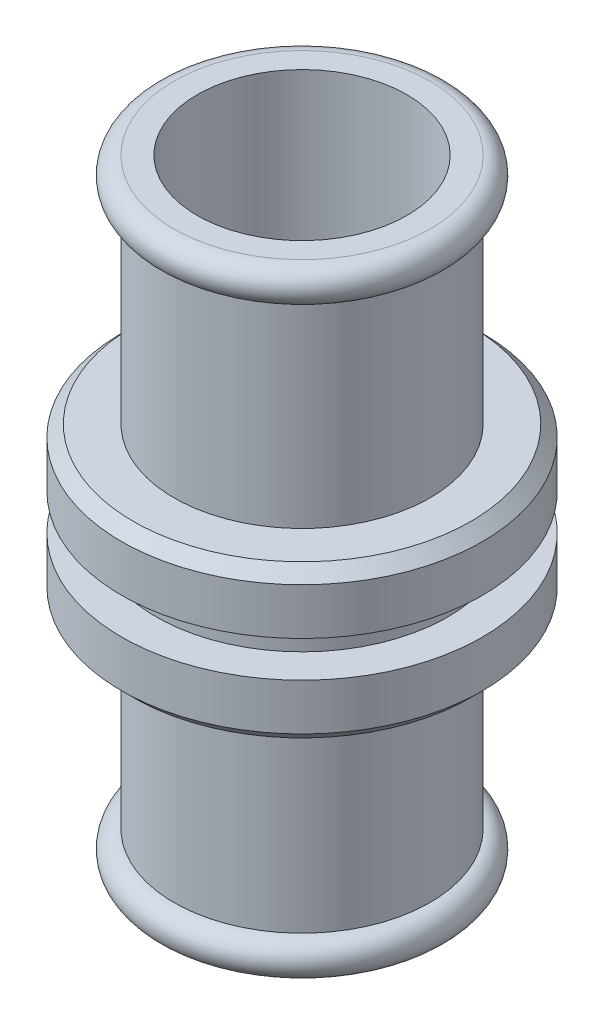
ISO-10303-21;
HEADER;
FILE_DESCRIPTION(('STEP AP214'),'2;1');
FILE_NAME('part.step','',(''),(''),'','','');
FILE_SCHEMA(('AUTOMOTIVE_DESIGN { 1 0 10303 214 1 1 1 1 }'));
ENDSEC;
DATA;
#1=APPLICATION_CONTEXT('core data for automotive mechanical design processes');
#2=APPLICATION_PROTOCOL_DEFINITION('international standard','automotive_design',2000,#1);
#3=PRODUCT_CONTEXT('',#1,'mechanical');
#4=PRODUCT('Part','Part','',(#3));
#5=PRODUCT_RELATED_PRODUCT_CATEGORY('part','',(#4));
#6=PRODUCT_DEFINITION_FORMATION('','',#4);
#7=PRODUCT_DEFINITION_CONTEXT('part definition',#1,'design');
#8=PRODUCT_DEFINITION('design','',#6,#7);
#9=PRODUCT_DEFINITION_SHAPE('','',#8);
#10=(LENGTH_UNIT() NAMED_UNIT(*) SI_UNIT(.MILLI.,.METRE.));
#11=(NAMED_UNIT(*) PLANE_ANGLE_UNIT() SI_UNIT($,.RADIAN.));
#12=(NAMED_UNIT(*) SI_UNIT($,.STERADIAN.) SOLID_ANGLE_UNIT());
#13=UNCERTAINTY_MEASURE_WITH_UNIT(LENGTH_MEASURE(1.E-05),#10,'distance_accuracy_value','');
#14=(GEOMETRIC_REPRESENTATION_CONTEXT(3) GLOBAL_UNCERTAINTY_ASSIGNED_CONTEXT((#13)) GLOBAL_UNIT_ASSIGNED_CONTEXT((#10,
#11,#12)) REPRESENTATION_CONTEXT('',''));
#15=CARTESIAN_POINT('',(0.,0.,0.));
#16=DIRECTION('',(0.,0.,1.));
#17=DIRECTION('',(1.,0.,0.));
#18=AXIS2_PLACEMENT_3D('',#15,#16,#17);
#19=CARTESIAN_POINT('',(-7.75000000000001,11.,0.));
#20=DIRECTION('',(0.,-1.,0.));
#21=DIRECTION('',(0.,0.,-1.));
#22=AXIS2_PLACEMENT_3D('',#19,#20,#21);
#23=TOROIDAL_SURFACE('',#22,11.,1.5);
#24=CARTESIAN_POINT('',(-7.75000000000001,9.49999999999995,0.));
#25=DIRECTION('',(0.,-1.,0.));
#26=DIRECTION('',(0.,0.,-1.));
#27=AXIS2_PLACEMENT_3D('',#24,#25,#26);
#28=CIRCLE('',#27,11.);
#29=CARTESIAN_POINT('',(-7.75000000000001,9.49999999999995,-11.));
#30=VERTEX_POINT('',#29);
#31=EDGE_CURVE('E94',#30,#30,#28,.T.);
#32=ORIENTED_EDGE('',*,*,#31,.F.);
#33=EDGE_LOOP('',(#32));
#34=FACE_BOUND('',#33,.T.);
#35=CARTESIAN_POINT('',(-7.75000000000001,12.5,0.));
#36=DIRECTION('',(0.,-1.,0.));
#37=DIRECTION('',(0.,0.,-1.));
#38=AXIS2_PLACEMENT_3D('',#35,#36,#37);
#39=CIRCLE('',#38,11.);
#40=CARTESIAN_POINT('',(-7.75000000000001,12.5,-11.));
#41=VERTEX_POINT('',#40);
#42=EDGE_CURVE('E12',#41,#41,#39,.T.);
#43=ORIENTED_EDGE('',*,*,#42,.T.);
#44=EDGE_LOOP('',(#43));
#45=FACE_BOUND('',#44,.T.);
#46=ADVANCED_FACE('F42',(#34,#45),#23,.T.);
#47=CARTESIAN_POINT('',(0.,12.5,0.));
#48=DIRECTION('',(0.,-1.,0.));
#49=DIRECTION('',(0.,0.,-1.));
#50=AXIS2_PLACEMENT_3D('',#47,#48,#49);
#51=PLANE('',#50);
#52=ORIENTED_EDGE('',*,*,#42,.F.);
#53=EDGE_LOOP('',(#52));
#54=FACE_BOUND('',#53,.T.);
#55=CARTESIAN_POINT('',(-7.75000000000001,12.5,0.));
#56=DIRECTION('',(0.,-1.,0.));
#57=DIRECTION('',(0.,0.,-1.));
#58=AXIS2_PLACEMENT_3D('',#55,#56,#57);
#59=CIRCLE('',#58,9.);
#60=CARTESIAN_POINT('',(-7.75000000000001,12.5,-9.));
#61=VERTEX_POINT('',#60);
#62=EDGE_CURVE('E48',#61,#61,#59,.T.);
#63=ORIENTED_EDGE('',*,*,#62,.T.);
#64=EDGE_LOOP('',(#63));
#65=FACE_BOUND('',#64,.T.);
#66=ADVANCED_FACE('F102',(#54,#65),#51,.F.);
#67=CARTESIAN_POINT('',(-7.75000000000001,-7.49999999999995,0.));
#68=DIRECTION('',(0.,-1.,0.));
#69=DIRECTION('',(0.,0.,-1.));
#70=AXIS2_PLACEMENT_3D('',#67,#68,#69);
#71=CYLINDRICAL_SURFACE('',#70,9.);
#72=CARTESIAN_POINT('',(-7.75000000000001,-40.6022761908766,0.));
#73=DIRECTION('',(0.,-1.,0.));
#74=DIRECTION('',(0.,0.,-1.));
#75=AXIS2_PLACEMENT_3D('',#72,#73,#74);
#76=CIRCLE('',#75,9.);
#77=CARTESIAN_POINT('',(-7.75000000000001,-40.6022761908766,-9.));
#78=VERTEX_POINT('',#77);
#79=EDGE_CURVE('E52',#78,#78,#76,.T.);
#80=ORIENTED_EDGE('',*,*,#79,.T.);
#81=EDGE_LOOP('',(#80));
#82=FACE_BOUND('',#81,.T.);
#83=ORIENTED_EDGE('',*,*,#62,.F.);
#84=EDGE_LOOP('',(#83));
#85=FACE_BOUND('',#84,.T.);
#86=ADVANCED_FACE('F106',(#82,#85),#71,.F.);
#87=CARTESIAN_POINT('',(-1.38777878078145E-13,-40.6022761908766,0.));
#88=DIRECTION('',(0.,-1.,0.));
#89=DIRECTION('',(0.,0.,-1.));
#90=AXIS2_PLACEMENT_3D('',#87,#88,#89);
#91=PLANE('',#90);
#92=CARTESIAN_POINT('',(-7.75000000000001,-40.6022761908766,0.));
#93=DIRECTION('',(0.,-1.,0.));
#94=DIRECTION('',(0.,0.,-1.));
#95=AXIS2_PLACEMENT_3D('',#92,#93,#94);
#96=CIRCLE('',#95,11.);
#97=CARTESIAN_POINT('',(-7.75000000000001,-40.6022761908766,-11.));
#98=VERTEX_POINT('',#97);
#99=EDGE_CURVE('E56',#98,#98,#96,.T.);
#100=ORIENTED_EDGE('',*,*,#99,.T.);
#101=EDGE_LOOP('',(#100));
#102=FACE_BOUND('',#101,.T.);
#103=ORIENTED_EDGE('',*,*,#79,.F.);
#104=EDGE_LOOP('',(#103));
#105=FACE_BOUND('',#104,.T.);
#106=ADVANCED_FACE('F111',(#102,#105),#91,.T.);
#107=CARTESIAN_POINT('',(-7.75000000000001,-39.1022761908767,0.));
#108=DIRECTION('',(0.,-1.,0.));
#109=DIRECTION('',(0.,0.,-1.));
#110=AXIS2_PLACEMENT_3D('',#107,#108,#109);
#111=TOROIDAL_SURFACE('',#110,11.,1.5);
#112=CARTESIAN_POINT('',(-7.75000000000001,-37.6022761908766,0.));
#113=DIRECTION('',(0.,-1.,0.));
#114=DIRECTION('',(0.,0.,-1.));
#115=AXIS2_PLACEMENT_3D('',#112,#113,#114);
#116=CIRCLE('',#115,11.);
#117=CARTESIAN_POINT('',(-7.75000000000001,-37.6022761908766,-11.));
#118=VERTEX_POINT('',#117);
#119=EDGE_CURVE('E61',#118,#118,#116,.T.);
#120=ORIENTED_EDGE('',*,*,#119,.T.);
#121=EDGE_LOOP('',(#120));
#122=FACE_BOUND('',#121,.T.);
#123=ORIENTED_EDGE('',*,*,#99,.F.);
#124=EDGE_LOOP('',(#123));
#125=FACE_BOUND('',#124,.T.);
#126=ADVANCED_FACE('F117',(#122,#125),#111,.T.);
#127=CARTESIAN_POINT('',(-7.75000000000001,-7.49999999999995,0.));
#128=DIRECTION('',(0.,-1.,0.));
#129=DIRECTION('',(0.,0.,-1.));
#130=AXIS2_PLACEMENT_3D('',#127,#128,#129);
#131=CYLINDRICAL_SURFACE('',#130,11.);
#132=ORIENTED_EDGE('',*,*,#119,.F.);
#133=EDGE_LOOP('',(#132));
#134=FACE_BOUND('',#133,.T.);
#135=CARTESIAN_POINT('',(-7.75000000000001,-20.6022761908766,0.));
#136=DIRECTION('',(0.,-1.,0.));
#137=DIRECTION('',(0.,0.,-1.));
#138=AXIS2_PLACEMENT_3D('',#135,#136,#137);
#139=CIRCLE('',#138,11.);
#140=CARTESIAN_POINT('',(-7.75000000000001,-20.6022761908766,-11.));
#141=VERTEX_POINT('',#140);
#142=EDGE_CURVE('E64',#141,#141,#139,.T.);
#143=ORIENTED_EDGE('',*,*,#142,.T.);
#144=EDGE_LOOP('',(#143));
#145=FACE_BOUND('',#144,.T.);
#146=ADVANCED_FACE('F121',(#134,#145),#131,.T.);
#147=CARTESIAN_POINT('',(0.,-20.6022761908766,0.));
#148=DIRECTION('',(0.,-1.,0.));
#149=DIRECTION('',(0.,0.,-1.));
#150=AXIS2_PLACEMENT_3D('',#147,#148,#149);
#151=PLANE('',#150);
#152=CARTESIAN_POINT('',(-7.75000000000001,-20.6022761908766,0.));
#153=DIRECTION('',(0.,-1.,0.));
#154=DIRECTION('',(0.,0.,-1.));
#155=AXIS2_PLACEMENT_3D('',#152,#153,#154);
#156=CIRCLE('',#155,14.5);
#157=CARTESIAN_POINT('',(-7.75000000000001,-20.6022761908766,-14.5));
#158=VERTEX_POINT('',#157);
#159=EDGE_CURVE('E67',#158,#158,#156,.T.);
#160=ORIENTED_EDGE('',*,*,#159,.T.);
#161=EDGE_LOOP('',(#160));
#162=FACE_BOUND('',#161,.T.);
#163=ORIENTED_EDGE('',*,*,#142,.F.);
#164=EDGE_LOOP('',(#163));
#165=FACE_BOUND('',#164,.T.);
#166=ADVANCED_FACE('F125',(#162,#165),#151,.T.);
#167=CARTESIAN_POINT('',(-7.75000000000001,-20.6022761908766,0.));
#168=DIRECTION('',(0.,1.,0.));
#169=DIRECTION('',(0.,0.,1.));
#170=AXIS2_PLACEMENT_3D('',#167,#168,#169);
#171=CONICAL_SURFACE('',#170,14.5,0.785398163397448);
#172=CARTESIAN_POINT('',(-7.75000000000001,-19.6022761908766,0.));
#173=DIRECTION('',(0.,-1.,0.));
#174=DIRECTION('',(0.,0.,-1.));
#175=AXIS2_PLACEMENT_3D('',#172,#173,#174);
#176=CIRCLE('',#175,15.5);
#177=CARTESIAN_POINT('',(-7.75000000000001,-19.6022761908766,-15.5));
#178=VERTEX_POINT('',#177);
#179=EDGE_CURVE('E70',#178,#178,#176,.T.);
#180=ORIENTED_EDGE('',*,*,#179,.T.);
#181=EDGE_LOOP('',(#180));
#182=FACE_BOUND('',#181,.T.);
#183=ORIENTED_EDGE('',*,*,#159,.F.);
#184=EDGE_LOOP('',(#183));
#185=FACE_BOUND('',#184,.T.);
#186=ADVANCED_FACE('F129',(#182,#185),#171,.T.);
#187=CARTESIAN_POINT('',(-7.75000000000001,-7.49999999999995,0.));
#188=DIRECTION('',(0.,-1.,0.));
#189=DIRECTION('',(0.,0.,-1.));
#190=AXIS2_PLACEMENT_3D('',#187,#188,#189);
#191=CYLINDRICAL_SURFACE('',#190,15.5);
#192=ORIENTED_EDGE('',*,*,#179,.F.);
#193=EDGE_LOOP('',(#192));
#194=FACE_BOUND('',#193,.T.);
#195=CARTESIAN_POINT('',(-7.75000000000001,-15.6022761908766,0.));
#196=DIRECTION('',(0.,-1.,0.));
#197=DIRECTION('',(0.,0.,-1.));
#198=AXIS2_PLACEMENT_3D('',#195,#196,#197);
#199=CIRCLE('',#198,15.5);
#200=CARTESIAN_POINT('',(-7.75000000000001,-15.6022761908766,-15.5));
#201=VERTEX_POINT('',#200);
#202=EDGE_CURVE('E73',#201,#201,#199,.T.);
#203=ORIENTED_EDGE('',*,*,#202,.T.);
#204=EDGE_LOOP('',(#203));
#205=FACE_BOUND('',#204,.T.);
#206=ADVANCED_FACE('F133',(#194,#205),#191,.T.);
#207=CARTESIAN_POINT('',(0.,-15.6022761908766,0.));
#208=DIRECTION('',(0.,-1.,0.));
#209=DIRECTION('',(0.,0.,-1.));
#210=AXIS2_PLACEMENT_3D('',#207,#208,#209);
#211=PLANE('',#210);
#212=ORIENTED_EDGE('',*,*,#202,.F.);
#213=EDGE_LOOP('',(#212));
#214=FACE_BOUND('',#213,.T.);
#215=CARTESIAN_POINT('',(-7.75000000000001,-15.6022761908766,0.));
#216=DIRECTION('',(0.,-1.,0.));
#217=DIRECTION('',(0.,0.,-1.));
#218=AXIS2_PLACEMENT_3D('',#215,#216,#217);
#219=CIRCLE('',#218,12.5152558718412);
#220=CARTESIAN_POINT('',(-7.75000000000001,-15.6022761908766,-12.5152558718412));
#221=VERTEX_POINT('',#220);
#222=EDGE_CURVE('E76',#221,#221,#219,.T.);
#223=ORIENTED_EDGE('',*,*,#222,.T.);
#224=EDGE_LOOP('',(#223));
#225=FACE_BOUND('',#224,.T.);
#226=ADVANCED_FACE('F137',(#214,#225),#211,.F.);
#227=CARTESIAN_POINT('',(-7.75000000000001,-7.49999999999995,0.));
#228=DIRECTION('',(0.,-1.,0.));
#229=DIRECTION('',(0.,0.,-1.));
#230=AXIS2_PLACEMENT_3D('',#227,#228,#229);
#231=CYLINDRICAL_SURFACE('',#230,12.5152558718412);
#232=ORIENTED_EDGE('',*,*,#222,.F.);
#233=EDGE_LOOP('',(#232));
#234=FACE_BOUND('',#233,.T.);
#235=CARTESIAN_POINT('',(-7.75000000000001,-12.5,0.));
#236=DIRECTION('',(0.,-1.,0.));
#237=DIRECTION('',(0.,0.,-1.));
#238=AXIS2_PLACEMENT_3D('',#235,#236,#237);
#239=CIRCLE('',#238,12.5152558718413);
#240=CARTESIAN_POINT('',(-7.75000000000001,-12.5,-12.5152558718413));
#241=VERTEX_POINT('',#240);
#242=EDGE_CURVE('E79',#241,#241,#239,.T.);
#243=ORIENTED_EDGE('',*,*,#242,.T.);
#244=EDGE_LOOP('',(#243));
#245=FACE_BOUND('',#244,.T.);
#246=ADVANCED_FACE('F141',(#234,#245),#231,.T.);
#247=CARTESIAN_POINT('',(0.,-12.5,0.));
#248=DIRECTION('',(0.,1.,0.));
#249=DIRECTION('',(0.,0.,1.));
#250=AXIS2_PLACEMENT_3D('',#247,#248,#249);
#251=PLANE('',#250);
#252=ORIENTED_EDGE('',*,*,#242,.F.);
#253=EDGE_LOOP('',(#252));
#254=FACE_BOUND('',#253,.T.);
#255=CARTESIAN_POINT('',(-7.75000000000001,-12.5,0.));
#256=DIRECTION('',(0.,-1.,0.));
#257=DIRECTION('',(0.,0.,-1.));
#258=AXIS2_PLACEMENT_3D('',#255,#256,#257);
#259=CIRCLE('',#258,15.5);
#260=CARTESIAN_POINT('',(-7.75000000000001,-12.5,-15.5));
#261=VERTEX_POINT('',#260);
#262=EDGE_CURVE('E82',#261,#261,#259,.T.);
#263=ORIENTED_EDGE('',*,*,#262,.T.);
#264=EDGE_LOOP('',(#263));
#265=FACE_BOUND('',#264,.T.);
#266=ADVANCED_FACE('F145',(#254,#265),#251,.F.);
#267=CARTESIAN_POINT('',(-7.75000000000001,-7.49999999999995,0.));
#268=DIRECTION('',(0.,-1.,0.));
#269=DIRECTION('',(0.,0.,-1.));
#270=AXIS2_PLACEMENT_3D('',#267,#268,#269);
#271=CYLINDRICAL_SURFACE('',#270,15.5);
#272=CARTESIAN_POINT('',(-7.75000000000001,-8.49999999999995,0.));
#273=DIRECTION('',(0.,-1.,0.));
#274=DIRECTION('',(0.,0.,-1.));
#275=AXIS2_PLACEMENT_3D('',#272,#273,#274);
#276=CIRCLE('',#275,15.5);
#277=CARTESIAN_POINT('',(-7.75000000000001,-8.49999999999995,-15.5));
#278=VERTEX_POINT('',#277);
#279=EDGE_CURVE('E85',#278,#278,#276,.T.);
#280=ORIENTED_EDGE('',*,*,#279,.T.);
#281=EDGE_LOOP('',(#280));
#282=FACE_BOUND('',#281,.T.);
#283=ORIENTED_EDGE('',*,*,#262,.F.);
#284=EDGE_LOOP('',(#283));
#285=FACE_BOUND('',#284,.T.);
#286=ADVANCED_FACE('F149',(#282,#285),#271,.T.);
#287=CARTESIAN_POINT('',(-7.75000000000001,-7.49999999999995,0.));
#288=DIRECTION('',(0.,-1.,0.));
#289=DIRECTION('',(0.,0.,-1.));
#290=AXIS2_PLACEMENT_3D('',#287,#288,#289);
#291=CONICAL_SURFACE('',#290,14.5,0.785398163397448);
#292=ORIENTED_EDGE('',*,*,#279,.F.);
#293=EDGE_LOOP('',(#292));
#294=FACE_BOUND('',#293,.T.);
#295=CARTESIAN_POINT('',(-7.75000000000001,-7.49999999999995,0.));
#296=DIRECTION('',(0.,-1.,0.));
#297=DIRECTION('',(0.,0.,-1.));
#298=AXIS2_PLACEMENT_3D('',#295,#296,#297);
#299=CIRCLE('',#298,14.5);
#300=CARTESIAN_POINT('',(-7.75000000000001,-7.49999999999995,-14.5));
#301=VERTEX_POINT('',#300);
#302=EDGE_CURVE('E88',#301,#301,#299,.T.);
#303=ORIENTED_EDGE('',*,*,#302,.T.);
#304=EDGE_LOOP('',(#303));
#305=FACE_BOUND('',#304,.T.);
#306=ADVANCED_FACE('F153',(#294,#305),#291,.T.);
#307=CARTESIAN_POINT('',(0.,-7.49999999999995,0.));
#308=DIRECTION('',(0.,-1.,0.));
#309=DIRECTION('',(0.,0.,-1.));
#310=AXIS2_PLACEMENT_3D('',#307,#308,#309);
#311=PLANE('',#310);
#312=ORIENTED_EDGE('',*,*,#302,.F.);
#313=EDGE_LOOP('',(#312));
#314=FACE_BOUND('',#313,.T.);
#315=CARTESIAN_POINT('',(-7.75000000000001,-7.49999999999995,0.));
#316=DIRECTION('',(0.,-1.,0.));
#317=DIRECTION('',(0.,0.,-1.));
#318=AXIS2_PLACEMENT_3D('',#315,#316,#317);
#319=CIRCLE('',#318,11.);
#320=CARTESIAN_POINT('',(-7.75000000000001,-7.49999999999995,-11.));
#321=VERTEX_POINT('',#320);
#322=EDGE_CURVE('E91',#321,#321,#319,.T.);
#323=ORIENTED_EDGE('',*,*,#322,.T.);
#324=EDGE_LOOP('',(#323));
#325=FACE_BOUND('',#324,.T.);
#326=ADVANCED_FACE('F157',(#314,#325),#311,.F.);
#327=CARTESIAN_POINT('',(-7.75000000000001,-7.49999999999995,0.));
#328=DIRECTION('',(0.,-1.,0.));
#329=DIRECTION('',(0.,0.,-1.));
#330=AXIS2_PLACEMENT_3D('',#327,#328,#329);
#331=CYLINDRICAL_SURFACE('',#330,11.);
#332=ORIENTED_EDGE('',*,*,#31,.T.);
#333=EDGE_LOOP('',(#332));
#334=FACE_BOUND('',#333,.T.);
#335=ORIENTED_EDGE('',*,*,#322,.F.);
#336=EDGE_LOOP('',(#335));
#337=FACE_BOUND('',#336,.T.);
#338=ADVANCED_FACE('F98',(#334,#337),#331,.T.);
#339=CLOSED_SHELL('',(#46,#66,#86,#106,#126,#146,#166,#186,#206,#226,#246,#266,#286,#306,#326,#338));
#340=MANIFOLD_SOLID_BREP('B2',#339);
#341=ADVANCED_BREP_SHAPE_REPRESENTATION('',(#18,#340),#14);
#342=SHAPE_DEFINITION_REPRESENTATION(#9,#341);
ENDSEC;
END-ISO-10303-21;
